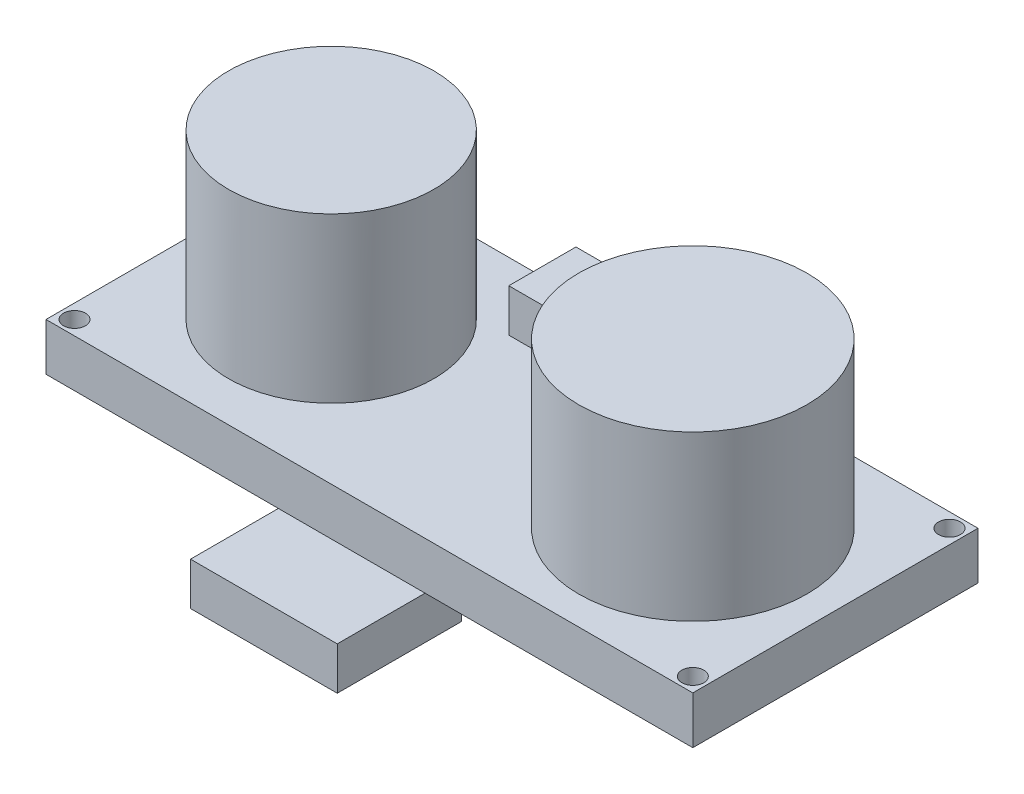
ISO-10303-21;
HEADER;
FILE_DESCRIPTION(('STEP AP214'),'2;1');
FILE_NAME('part.step','',(''),(''),'','','');
FILE_SCHEMA(('AUTOMOTIVE_DESIGN { 1 0 10303 214 1 1 1 1 }'));
ENDSEC;
DATA;
#1=APPLICATION_CONTEXT('core data for automotive mechanical design processes');
#2=APPLICATION_PROTOCOL_DEFINITION('international standard','automotive_design',2000,#1);
#3=PRODUCT_CONTEXT('',#1,'mechanical');
#4=PRODUCT('Part','Part','',(#3));
#5=PRODUCT_RELATED_PRODUCT_CATEGORY('part','',(#4));
#6=PRODUCT_DEFINITION_FORMATION('','',#4);
#7=PRODUCT_DEFINITION_CONTEXT('part definition',#1,'design');
#8=PRODUCT_DEFINITION('design','',#6,#7);
#9=PRODUCT_DEFINITION_SHAPE('','',#8);
#10=(LENGTH_UNIT() NAMED_UNIT(*) SI_UNIT(.MILLI.,.METRE.));
#11=(NAMED_UNIT(*) PLANE_ANGLE_UNIT() SI_UNIT($,.RADIAN.));
#12=(NAMED_UNIT(*) SI_UNIT($,.STERADIAN.) SOLID_ANGLE_UNIT());
#13=UNCERTAINTY_MEASURE_WITH_UNIT(LENGTH_MEASURE(1.E-05),#10,'distance_accuracy_value','');
#14=(GEOMETRIC_REPRESENTATION_CONTEXT(3) GLOBAL_UNCERTAINTY_ASSIGNED_CONTEXT((#13)) GLOBAL_UNIT_ASSIGNED_CONTEXT((#10,
#11,#12)) REPRESENTATION_CONTEXT('',''));
#15=CARTESIAN_POINT('',(0.,0.,0.));
#16=DIRECTION('',(0.,0.,1.));
#17=DIRECTION('',(1.,0.,0.));
#18=AXIS2_PLACEMENT_3D('',#15,#16,#17);
#19=CARTESIAN_POINT('',(0.,3.33,0.));
#20=DIRECTION('',(0.,-1.,0.));
#21=DIRECTION('',(0.,0.,-1.));
#22=AXIS2_PLACEMENT_3D('',#19,#20,#21);
#23=PLANE('',#22);
#24=CARTESIAN_POINT('',(-12.68,3.33,0.));
#25=DIRECTION('',(0.,-1.,0.));
#26=DIRECTION('',(0.,0.,-1.));
#27=AXIS2_PLACEMENT_3D('',#24,#25,#26);
#28=CIRCLE('',#27,7.20177005113428);
#29=CARTESIAN_POINT('',(-12.68,3.33,-7.20177005113428));
#30=VERTEX_POINT('',#29);
#31=EDGE_CURVE('E42',#30,#30,#28,.F.);
#32=ORIENTED_EDGE('',*,*,#31,.F.);
#33=EDGE_LOOP('',(#32));
#34=FACE_BOUND('',#33,.T.);
#35=DIRECTION('',(0.,0.,-1.));
#36=VECTOR('',#35,1.);
#37=CARTESIAN_POINT('',(22.68,3.33,10.));
#38=LINE('',#37,#36);
#39=CARTESIAN_POINT('',(22.68,3.33,10.));
#40=VERTEX_POINT('',#39);
#41=CARTESIAN_POINT('',(22.68,3.33,-10.));
#42=VERTEX_POINT('',#41);
#43=EDGE_CURVE('E212',#40,#42,#38,.T.);
#44=ORIENTED_EDGE('',*,*,#43,.T.);
#45=DIRECTION('',(-1.,0.,0.));
#46=VECTOR('',#45,1.);
#47=CARTESIAN_POINT('',(-22.68,3.33,-10.));
#48=LINE('',#47,#46);
#49=CARTESIAN_POINT('',(-22.68,3.33,-10.));
#50=VERTEX_POINT('',#49);
#51=EDGE_CURVE('E215',#42,#50,#48,.T.);
#52=ORIENTED_EDGE('',*,*,#51,.T.);
#53=DIRECTION('',(0.,0.,1.));
#54=VECTOR('',#53,1.);
#55=CARTESIAN_POINT('',(-22.68,3.33,10.));
#56=LINE('',#55,#54);
#57=CARTESIAN_POINT('',(-22.68,3.33,10.));
#58=VERTEX_POINT('',#57);
#59=EDGE_CURVE('E218',#50,#58,#56,.T.);
#60=ORIENTED_EDGE('',*,*,#59,.T.);
#61=DIRECTION('',(1.,0.,0.));
#62=VECTOR('',#61,1.);
#63=CARTESIAN_POINT('',(-22.68,3.33,10.));
#64=LINE('',#63,#62);
#65=EDGE_CURVE('E220',#58,#40,#64,.T.);
#66=ORIENTED_EDGE('',*,*,#65,.T.);
#67=EDGE_LOOP('',(#44,#52,#60,#66));
#68=FACE_BOUND('',#67,.T.);
#69=CARTESIAN_POINT('',(12.68,3.33,0.));
#70=DIRECTION('',(0.,-1.,0.));
#71=DIRECTION('',(0.,0.,-1.));
#72=AXIS2_PLACEMENT_3D('',#69,#70,#71);
#73=CIRCLE('',#72,8.);
#74=CARTESIAN_POINT('',(12.68,3.33,-8.));
#75=VERTEX_POINT('',#74);
#76=EDGE_CURVE('E243',#75,#75,#73,.F.);
#77=ORIENTED_EDGE('',*,*,#76,.F.);
#78=EDGE_LOOP('',(#77));
#79=FACE_BOUND('',#78,.T.);
#80=CARTESIAN_POINT('',(21.68,3.33,-9.));
#81=DIRECTION('',(0.,1.,0.));
#82=DIRECTION('',(0.,0.,1.));
#83=AXIS2_PLACEMENT_3D('',#80,#81,#82);
#84=CIRCLE('',#83,0.769999999999999);
#85=CARTESIAN_POINT('',(21.68,3.33,-8.23));
#86=VERTEX_POINT('',#85);
#87=EDGE_CURVE('E201',#86,#86,#84,.T.);
#88=ORIENTED_EDGE('',*,*,#87,.F.);
#89=EDGE_LOOP('',(#88));
#90=FACE_BOUND('',#89,.T.);
#91=CARTESIAN_POINT('',(21.68,3.33,9.));
#92=DIRECTION('',(0.,1.,0.));
#93=DIRECTION('',(0.,0.,1.));
#94=AXIS2_PLACEMENT_3D('',#91,#92,#93);
#95=CIRCLE('',#94,0.769999999999999);
#96=CARTESIAN_POINT('',(21.68,3.33,9.77));
#97=VERTEX_POINT('',#96);
#98=EDGE_CURVE('E197',#97,#97,#95,.T.);
#99=ORIENTED_EDGE('',*,*,#98,.F.);
#100=EDGE_LOOP('',(#99));
#101=FACE_BOUND('',#100,.T.);
#102=CARTESIAN_POINT('',(-21.68,3.33,9.));
#103=DIRECTION('',(0.,1.,0.));
#104=DIRECTION('',(0.,0.,1.));
#105=AXIS2_PLACEMENT_3D('',#102,#103,#104);
#106=CIRCLE('',#105,0.769999999999999);
#107=CARTESIAN_POINT('',(-21.68,3.33,9.77));
#108=VERTEX_POINT('',#107);
#109=EDGE_CURVE('E193',#108,#108,#106,.T.);
#110=ORIENTED_EDGE('',*,*,#109,.F.);
#111=EDGE_LOOP('',(#110));
#112=FACE_BOUND('',#111,.T.);
#113=CARTESIAN_POINT('',(-21.68,3.33,-9.));
#114=DIRECTION('',(0.,1.,0.));
#115=DIRECTION('',(0.,0.,1.));
#116=AXIS2_PLACEMENT_3D('',#113,#114,#115);
#117=CIRCLE('',#116,0.769999999999999);
#118=CARTESIAN_POINT('',(-21.68,3.33,-8.23));
#119=VERTEX_POINT('',#118);
#120=EDGE_CURVE('E190',#119,#119,#117,.T.);
#121=ORIENTED_EDGE('',*,*,#120,.F.);
#122=EDGE_LOOP('',(#121));
#123=FACE_BOUND('',#122,.T.);
#124=DIRECTION('',(0.,0.,1.));
#125=VECTOR('',#124,1.);
#126=CARTESIAN_POINT('',(-5.5,3.33,-5.275));
#127=LINE('',#126,#125);
#128=CARTESIAN_POINT('',(-5.5,3.33,-9.985));
#129=VERTEX_POINT('',#128);
#130=CARTESIAN_POINT('',(-5.5,3.33,-5.275));
#131=VERTEX_POINT('',#130);
#132=EDGE_CURVE('E152',#129,#131,#127,.T.);
#133=ORIENTED_EDGE('',*,*,#132,.F.);
#134=DIRECTION('',(-1.,0.,0.));
#135=VECTOR('',#134,1.);
#136=CARTESIAN_POINT('',(5.5,3.33,-9.985));
#137=LINE('',#136,#135);
#138=CARTESIAN_POINT('',(5.5,3.33,-9.985));
#139=VERTEX_POINT('',#138);
#140=EDGE_CURVE('E165',#139,#129,#137,.T.);
#141=ORIENTED_EDGE('',*,*,#140,.F.);
#142=DIRECTION('',(0.,0.,-1.));
#143=VECTOR('',#142,1.);
#144=CARTESIAN_POINT('',(5.5,3.33,-5.275));
#145=LINE('',#144,#143);
#146=CARTESIAN_POINT('',(5.5,3.33,-5.275));
#147=VERTEX_POINT('',#146);
#148=EDGE_CURVE('E174',#147,#139,#145,.T.);
#149=ORIENTED_EDGE('',*,*,#148,.F.);
#150=DIRECTION('',(1.,0.,0.));
#151=VECTOR('',#150,1.);
#152=CARTESIAN_POINT('',(5.5,3.33,-5.275));
#153=LINE('',#152,#151);
#154=EDGE_CURVE('E155',#131,#147,#153,.T.);
#155=ORIENTED_EDGE('',*,*,#154,.F.);
#156=EDGE_LOOP('',(#133,#141,#149,#155));
#157=FACE_BOUND('',#156,.T.);
#158=ADVANCED_FACE('F33',(#34,#68,#79,#90,#101,#112,#123,#157),#23,.F.);
#159=CARTESIAN_POINT('',(22.68,3.33,10.));
#160=DIRECTION('',(-1.,0.,0.));
#161=DIRECTION('',(0.,0.,1.));
#162=AXIS2_PLACEMENT_3D('',#159,#160,#161);
#163=PLANE('',#162);
#164=DIRECTION('',(0.,0.,-1.));
#165=VECTOR('',#164,1.);
#166=CARTESIAN_POINT('',(22.68,0.,10.));
#167=LINE('',#166,#165);
#168=CARTESIAN_POINT('',(22.68,0.,10.));
#169=VERTEX_POINT('',#168);
#170=CARTESIAN_POINT('',(22.68,0.,-10.));
#171=VERTEX_POINT('',#170);
#172=EDGE_CURVE('E211',#169,#171,#167,.T.);
#173=ORIENTED_EDGE('',*,*,#172,.T.);
#174=DIRECTION('',(0.,-1.,0.));
#175=VECTOR('',#174,1.);
#176=CARTESIAN_POINT('',(22.68,3.33,-10.));
#177=LINE('',#176,#175);
#178=EDGE_CURVE('E240',#42,#171,#177,.T.);
#179=ORIENTED_EDGE('',*,*,#178,.F.);
#180=ORIENTED_EDGE('',*,*,#43,.F.);
#181=DIRECTION('',(0.,-1.,0.));
#182=VECTOR('',#181,1.);
#183=CARTESIAN_POINT('',(22.68,3.33,10.));
#184=LINE('',#183,#182);
#185=EDGE_CURVE('E222',#40,#169,#184,.T.);
#186=ORIENTED_EDGE('',*,*,#185,.T.);
#187=EDGE_LOOP('',(#173,#179,#180,#186));
#188=FACE_BOUND('',#187,.T.);
#189=ADVANCED_FACE('F35',(#188),#163,.F.);
#190=CARTESIAN_POINT('',(-22.68,3.33,-10.));
#191=DIRECTION('',(0.,0.,1.));
#192=DIRECTION('',(1.,0.,0.));
#193=AXIS2_PLACEMENT_3D('',#190,#191,#192);
#194=PLANE('',#193);
#195=DIRECTION('',(-1.,0.,0.));
#196=VECTOR('',#195,1.);
#197=CARTESIAN_POINT('',(-22.68,0.,-10.));
#198=LINE('',#197,#196);
#199=CARTESIAN_POINT('',(-22.68,0.,-10.));
#200=VERTEX_POINT('',#199);
#201=EDGE_CURVE('E225',#171,#200,#198,.T.);
#202=ORIENTED_EDGE('',*,*,#201,.T.);
#203=DIRECTION('',(0.,-1.,0.));
#204=VECTOR('',#203,1.);
#205=CARTESIAN_POINT('',(-22.68,3.33,-10.));
#206=LINE('',#205,#204);
#207=EDGE_CURVE('E237',#50,#200,#206,.T.);
#208=ORIENTED_EDGE('',*,*,#207,.F.);
#209=ORIENTED_EDGE('',*,*,#51,.F.);
#210=ORIENTED_EDGE('',*,*,#178,.T.);
#211=EDGE_LOOP('',(#202,#208,#209,#210));
#212=FACE_BOUND('',#211,.T.);
#213=ADVANCED_FACE('F340',(#212),#194,.F.);
#214=CARTESIAN_POINT('',(-22.68,3.33,10.));
#215=DIRECTION('',(1.,0.,0.));
#216=DIRECTION('',(0.,0.,-1.));
#217=AXIS2_PLACEMENT_3D('',#214,#215,#216);
#218=PLANE('',#217);
#219=DIRECTION('',(0.,0.,1.));
#220=VECTOR('',#219,1.);
#221=CARTESIAN_POINT('',(-22.68,0.,10.));
#222=LINE('',#221,#220);
#223=CARTESIAN_POINT('',(-22.68,0.,10.));
#224=VERTEX_POINT('',#223);
#225=EDGE_CURVE('E227',#200,#224,#222,.T.);
#226=ORIENTED_EDGE('',*,*,#225,.T.);
#227=DIRECTION('',(0.,-1.,0.));
#228=VECTOR('',#227,1.);
#229=CARTESIAN_POINT('',(-22.68,3.33,10.));
#230=LINE('',#229,#228);
#231=EDGE_CURVE('E234',#58,#224,#230,.T.);
#232=ORIENTED_EDGE('',*,*,#231,.F.);
#233=ORIENTED_EDGE('',*,*,#59,.F.);
#234=ORIENTED_EDGE('',*,*,#207,.T.);
#235=EDGE_LOOP('',(#226,#232,#233,#234));
#236=FACE_BOUND('',#235,.T.);
#237=ADVANCED_FACE('F337',(#236),#218,.F.);
#238=CARTESIAN_POINT('',(-22.68,3.33,10.));
#239=DIRECTION('',(0.,0.,-1.));
#240=DIRECTION('',(-1.,0.,0.));
#241=AXIS2_PLACEMENT_3D('',#238,#239,#240);
#242=PLANE('',#241);
#243=DIRECTION('',(1.,0.,0.));
#244=VECTOR('',#243,1.);
#245=CARTESIAN_POINT('',(-22.68,0.,10.));
#246=LINE('',#245,#244);
#247=CARTESIAN_POINT('',(-6.38493764608229,0.,10.));
#248=VERTEX_POINT('',#247);
#249=EDGE_CURVE('E216',#224,#248,#246,.T.);
#250=ORIENTED_EDGE('',*,*,#249,.T.);
#251=CARTESIAN_POINT('',(3.90506235391771,0.,10.));
#252=VERTEX_POINT('',#251);
#253=EDGE_CURVE('E231',#248,#252,#246,.T.);
#254=ORIENTED_EDGE('',*,*,#253,.T.);
#255=EDGE_CURVE('E56',#252,#169,#246,.T.);
#256=ORIENTED_EDGE('',*,*,#255,.T.);
#257=ORIENTED_EDGE('',*,*,#185,.F.);
#258=ORIENTED_EDGE('',*,*,#65,.F.);
#259=ORIENTED_EDGE('',*,*,#231,.T.);
#260=EDGE_LOOP('',(#250,#254,#256,#257,#258,#259));
#261=FACE_BOUND('',#260,.T.);
#262=ADVANCED_FACE('F261',(#261),#242,.F.);
#263=CARTESIAN_POINT('',(0.,0.,0.));
#264=DIRECTION('',(0.,-1.,0.));
#265=DIRECTION('',(0.,0.,-1.));
#266=AXIS2_PLACEMENT_3D('',#263,#264,#265);
#267=PLANE('',#266);
#268=DIRECTION('',(0.,0.,-1.));
#269=VECTOR('',#268,1.);
#270=CARTESIAN_POINT('',(-6.38493764608228,0.,16.16));
#271=LINE('',#270,#269);
#272=CARTESIAN_POINT('',(-6.38493764608228,0.,7.46));
#273=VERTEX_POINT('',#272);
#274=EDGE_CURVE('E11',#248,#273,#271,.T.);
#275=ORIENTED_EDGE('',*,*,#274,.F.);
#276=ORIENTED_EDGE('',*,*,#249,.F.);
#277=ORIENTED_EDGE('',*,*,#225,.F.);
#278=ORIENTED_EDGE('',*,*,#201,.F.);
#279=ORIENTED_EDGE('',*,*,#172,.F.);
#280=ORIENTED_EDGE('',*,*,#255,.F.);
#281=DIRECTION('',(0.,0.,1.));
#282=VECTOR('',#281,1.);
#283=CARTESIAN_POINT('',(3.90506235391772,0.,16.16));
#284=LINE('',#283,#282);
#285=CARTESIAN_POINT('',(3.90506235391772,0.,7.46));
#286=VERTEX_POINT('',#285);
#287=EDGE_CURVE('E369',#286,#252,#284,.T.);
#288=ORIENTED_EDGE('',*,*,#287,.F.);
#289=DIRECTION('',(1.,0.,0.));
#290=VECTOR('',#289,1.);
#291=CARTESIAN_POINT('',(3.90506235391772,0.,7.46));
#292=LINE('',#291,#290);
#293=EDGE_CURVE('E51',#273,#286,#292,.T.);
#294=ORIENTED_EDGE('',*,*,#293,.F.);
#295=EDGE_LOOP('',(#275,#276,#277,#278,#279,#280,#288,#294));
#296=FACE_BOUND('',#295,.T.);
#297=CARTESIAN_POINT('',(-21.68,0.,-9.));
#298=DIRECTION('',(0.,-1.,0.));
#299=DIRECTION('',(0.,0.,-1.));
#300=AXIS2_PLACEMENT_3D('',#297,#298,#299);
#301=CIRCLE('',#300,0.769999999999999);
#302=CARTESIAN_POINT('',(-21.68,0.,-9.77));
#303=VERTEX_POINT('',#302);
#304=EDGE_CURVE('E37',#303,#303,#301,.T.);
#305=ORIENTED_EDGE('',*,*,#304,.F.);
#306=EDGE_LOOP('',(#305));
#307=FACE_BOUND('',#306,.T.);
#308=CARTESIAN_POINT('',(-21.68,0.,9.));
#309=DIRECTION('',(0.,-1.,0.));
#310=DIRECTION('',(0.,0.,-1.));
#311=AXIS2_PLACEMENT_3D('',#308,#309,#310);
#312=CIRCLE('',#311,0.769999999999999);
#313=CARTESIAN_POINT('',(-21.68,0.,8.23));
#314=VERTEX_POINT('',#313);
#315=EDGE_CURVE('E196',#314,#314,#312,.T.);
#316=ORIENTED_EDGE('',*,*,#315,.F.);
#317=EDGE_LOOP('',(#316));
#318=FACE_BOUND('',#317,.T.);
#319=CARTESIAN_POINT('',(21.68,0.,9.));
#320=DIRECTION('',(0.,-1.,0.));
#321=DIRECTION('',(0.,0.,-1.));
#322=AXIS2_PLACEMENT_3D('',#319,#320,#321);
#323=CIRCLE('',#322,0.769999999999999);
#324=CARTESIAN_POINT('',(21.68,0.,8.23));
#325=VERTEX_POINT('',#324);
#326=EDGE_CURVE('E200',#325,#325,#323,.T.);
#327=ORIENTED_EDGE('',*,*,#326,.F.);
#328=EDGE_LOOP('',(#327));
#329=FACE_BOUND('',#328,.T.);
#330=CARTESIAN_POINT('',(21.68,0.,-9.));
#331=DIRECTION('',(0.,-1.,0.));
#332=DIRECTION('',(0.,0.,-1.));
#333=AXIS2_PLACEMENT_3D('',#330,#331,#332);
#334=CIRCLE('',#333,0.769999999999999);
#335=CARTESIAN_POINT('',(21.68,0.,-9.77));
#336=VERTEX_POINT('',#335);
#337=EDGE_CURVE('E204',#336,#336,#334,.T.);
#338=ORIENTED_EDGE('',*,*,#337,.F.);
#339=EDGE_LOOP('',(#338));
#340=FACE_BOUND('',#339,.T.);
#341=ADVANCED_FACE('F257',(#296,#307,#318,#329,#340),#267,.T.);
#342=CARTESIAN_POINT('',(12.68,14.83,0.));
#343=DIRECTION('',(0.,-1.,0.));
#344=DIRECTION('',(0.,0.,-1.));
#345=AXIS2_PLACEMENT_3D('',#342,#343,#344);
#346=CYLINDRICAL_SURFACE('',#345,8.);
#347=CARTESIAN_POINT('',(12.68,14.83,0.));
#348=DIRECTION('',(0.,1.,0.));
#349=DIRECTION('',(0.,0.,1.));
#350=AXIS2_PLACEMENT_3D('',#347,#348,#349);
#351=CIRCLE('',#350,8.);
#352=CARTESIAN_POINT('',(12.68,14.83,8.));
#353=VERTEX_POINT('',#352);
#354=EDGE_CURVE('E208',#353,#353,#351,.T.);
#355=ORIENTED_EDGE('',*,*,#354,.F.);
#356=EDGE_LOOP('',(#355));
#357=FACE_BOUND('',#356,.T.);
#358=ORIENTED_EDGE('',*,*,#76,.T.);
#359=EDGE_LOOP('',(#358));
#360=FACE_BOUND('',#359,.T.);
#361=ADVANCED_FACE('F260',(#357,#360),#346,.T.);
#362=CARTESIAN_POINT('',(12.68,14.83,0.));
#363=DIRECTION('',(0.,1.,0.));
#364=DIRECTION('',(0.,0.,1.));
#365=AXIS2_PLACEMENT_3D('',#362,#363,#364);
#366=PLANE('',#365);
#367=ORIENTED_EDGE('',*,*,#354,.T.);
#368=EDGE_LOOP('',(#367));
#369=FACE_BOUND('',#368,.T.);
#370=ADVANCED_FACE('F327',(#369),#366,.T.);
#371=CARTESIAN_POINT('',(-12.68,14.83,0.));
#372=DIRECTION('',(0.,-1.,0.));
#373=DIRECTION('',(0.,0.,-1.));
#374=AXIS2_PLACEMENT_3D('',#371,#372,#373);
#375=CYLINDRICAL_SURFACE('',#374,7.20177005113428);
#376=CARTESIAN_POINT('',(-12.68,14.83,0.));
#377=DIRECTION('',(0.,1.,0.));
#378=DIRECTION('',(0.,0.,1.));
#379=AXIS2_PLACEMENT_3D('',#376,#377,#378);
#380=CIRCLE('',#379,7.20177005113428);
#381=CARTESIAN_POINT('',(-12.68,14.83,7.20177005113428));
#382=VERTEX_POINT('',#381);
#383=EDGE_CURVE('E205',#382,#382,#380,.T.);
#384=ORIENTED_EDGE('',*,*,#383,.F.);
#385=EDGE_LOOP('',(#384));
#386=FACE_BOUND('',#385,.T.);
#387=ORIENTED_EDGE('',*,*,#31,.T.);
#388=EDGE_LOOP('',(#387));
#389=FACE_BOUND('',#388,.T.);
#390=ADVANCED_FACE('F323',(#386,#389),#375,.T.);
#391=CARTESIAN_POINT('',(-12.68,14.83,0.));
#392=DIRECTION('',(0.,1.,0.));
#393=DIRECTION('',(0.,0.,1.));
#394=AXIS2_PLACEMENT_3D('',#391,#392,#393);
#395=PLANE('',#394);
#396=ORIENTED_EDGE('',*,*,#383,.T.);
#397=EDGE_LOOP('',(#396));
#398=FACE_BOUND('',#397,.T.);
#399=ADVANCED_FACE('F271',(#398),#395,.T.);
#400=CARTESIAN_POINT('',(21.68,-8.17,-9.));
#401=DIRECTION('',(0.,1.,0.));
#402=DIRECTION('',(0.,0.,1.));
#403=AXIS2_PLACEMENT_3D('',#400,#401,#402);
#404=CYLINDRICAL_SURFACE('',#403,0.769999999999999);
#405=ORIENTED_EDGE('',*,*,#337,.T.);
#406=EDGE_LOOP('',(#405));
#407=FACE_BOUND('',#406,.T.);
#408=ORIENTED_EDGE('',*,*,#87,.T.);
#409=EDGE_LOOP('',(#408));
#410=FACE_BOUND('',#409,.T.);
#411=ADVANCED_FACE('F267',(#407,#410),#404,.F.);
#412=CARTESIAN_POINT('',(21.68,-8.17,9.));
#413=DIRECTION('',(0.,1.,0.));
#414=DIRECTION('',(0.,0.,1.));
#415=AXIS2_PLACEMENT_3D('',#412,#413,#414);
#416=CYLINDRICAL_SURFACE('',#415,0.769999999999999);
#417=ORIENTED_EDGE('',*,*,#326,.T.);
#418=EDGE_LOOP('',(#417));
#419=FACE_BOUND('',#418,.T.);
#420=ORIENTED_EDGE('',*,*,#98,.T.);
#421=EDGE_LOOP('',(#420));
#422=FACE_BOUND('',#421,.T.);
#423=ADVANCED_FACE('F270',(#419,#422),#416,.F.);
#424=CARTESIAN_POINT('',(-21.68,-8.17,9.));
#425=DIRECTION('',(0.,1.,0.));
#426=DIRECTION('',(0.,0.,1.));
#427=AXIS2_PLACEMENT_3D('',#424,#425,#426);
#428=CYLINDRICAL_SURFACE('',#427,0.769999999999999);
#429=ORIENTED_EDGE('',*,*,#315,.T.);
#430=EDGE_LOOP('',(#429));
#431=FACE_BOUND('',#430,.T.);
#432=ORIENTED_EDGE('',*,*,#109,.T.);
#433=EDGE_LOOP('',(#432));
#434=FACE_BOUND('',#433,.T.);
#435=ADVANCED_FACE('F254',(#431,#434),#428,.F.);
#436=CARTESIAN_POINT('',(-21.68,-8.17,-9.));
#437=DIRECTION('',(0.,1.,0.));
#438=DIRECTION('',(0.,0.,1.));
#439=AXIS2_PLACEMENT_3D('',#436,#437,#438);
#440=CYLINDRICAL_SURFACE('',#439,0.769999999999999);
#441=ORIENTED_EDGE('',*,*,#304,.T.);
#442=EDGE_LOOP('',(#441));
#443=FACE_BOUND('',#442,.T.);
#444=ORIENTED_EDGE('',*,*,#120,.T.);
#445=EDGE_LOOP('',(#444));
#446=FACE_BOUND('',#445,.T.);
#447=ADVANCED_FACE('F309',(#443,#446),#440,.F.);
#448=CARTESIAN_POINT('',(-5.5,6.33,-5.275));
#449=DIRECTION('',(1.,0.,0.));
#450=DIRECTION('',(0.,0.,-1.));
#451=AXIS2_PLACEMENT_3D('',#448,#449,#450);
#452=PLANE('',#451);
#453=ORIENTED_EDGE('',*,*,#132,.T.);
#454=DIRECTION('',(0.,-1.,0.));
#455=VECTOR('',#454,1.);
#456=CARTESIAN_POINT('',(-5.5,6.33,-5.275));
#457=LINE('',#456,#455);
#458=CARTESIAN_POINT('',(-5.5,6.33,-5.275));
#459=VERTEX_POINT('',#458);
#460=EDGE_CURVE('E187',#459,#131,#457,.T.);
#461=ORIENTED_EDGE('',*,*,#460,.F.);
#462=DIRECTION('',(0.,0.,1.));
#463=VECTOR('',#462,1.);
#464=CARTESIAN_POINT('',(-5.5,6.33,-5.275));
#465=LINE('',#464,#463);
#466=CARTESIAN_POINT('',(-5.5,6.33,-9.985));
#467=VERTEX_POINT('',#466);
#468=EDGE_CURVE('E161',#467,#459,#465,.T.);
#469=ORIENTED_EDGE('',*,*,#468,.F.);
#470=DIRECTION('',(0.,-1.,0.));
#471=VECTOR('',#470,1.);
#472=CARTESIAN_POINT('',(-5.5,6.33,-9.985));
#473=LINE('',#472,#471);
#474=EDGE_CURVE('E170',#467,#129,#473,.T.);
#475=ORIENTED_EDGE('',*,*,#474,.T.);
#476=EDGE_LOOP('',(#453,#461,#469,#475));
#477=FACE_BOUND('',#476,.T.);
#478=ADVANCED_FACE('F293',(#477),#452,.F.);
#479=CARTESIAN_POINT('',(5.5,6.33,-5.275));
#480=DIRECTION('',(0.,0.,-1.));
#481=DIRECTION('',(-1.,0.,0.));
#482=AXIS2_PLACEMENT_3D('',#479,#480,#481);
#483=PLANE('',#482);
#484=ORIENTED_EDGE('',*,*,#154,.T.);
#485=DIRECTION('',(0.,-1.,0.));
#486=VECTOR('',#485,1.);
#487=CARTESIAN_POINT('',(5.5,6.33,-5.275));
#488=LINE('',#487,#486);
#489=CARTESIAN_POINT('',(5.5,6.33,-5.275));
#490=VERTEX_POINT('',#489);
#491=EDGE_CURVE('E184',#490,#147,#488,.T.);
#492=ORIENTED_EDGE('',*,*,#491,.F.);
#493=DIRECTION('',(1.,0.,0.));
#494=VECTOR('',#493,1.);
#495=CARTESIAN_POINT('',(5.5,6.33,-5.275));
#496=LINE('',#495,#494);
#497=EDGE_CURVE('E164',#459,#490,#496,.T.);
#498=ORIENTED_EDGE('',*,*,#497,.F.);
#499=ORIENTED_EDGE('',*,*,#460,.T.);
#500=EDGE_LOOP('',(#484,#492,#498,#499));
#501=FACE_BOUND('',#500,.T.);
#502=ADVANCED_FACE('F301',(#501),#483,.F.);
#503=CARTESIAN_POINT('',(5.5,6.33,-5.275));
#504=DIRECTION('',(-1.,0.,0.));
#505=DIRECTION('',(0.,0.,1.));
#506=AXIS2_PLACEMENT_3D('',#503,#504,#505);
#507=PLANE('',#506);
#508=ORIENTED_EDGE('',*,*,#148,.T.);
#509=DIRECTION('',(0.,-1.,0.));
#510=VECTOR('',#509,1.);
#511=CARTESIAN_POINT('',(5.5,6.33,-9.985));
#512=LINE('',#511,#510);
#513=CARTESIAN_POINT('',(5.5,6.33,-9.985));
#514=VERTEX_POINT('',#513);
#515=EDGE_CURVE('E181',#514,#139,#512,.T.);
#516=ORIENTED_EDGE('',*,*,#515,.F.);
#517=DIRECTION('',(0.,0.,-1.));
#518=VECTOR('',#517,1.);
#519=CARTESIAN_POINT('',(5.5,6.33,-5.275));
#520=LINE('',#519,#518);
#521=EDGE_CURVE('E167',#490,#514,#520,.T.);
#522=ORIENTED_EDGE('',*,*,#521,.F.);
#523=ORIENTED_EDGE('',*,*,#491,.T.);
#524=EDGE_LOOP('',(#508,#516,#522,#523));
#525=FACE_BOUND('',#524,.T.);
#526=ADVANCED_FACE('F299',(#525),#507,.F.);
#527=CARTESIAN_POINT('',(5.5,6.33,-9.985));
#528=DIRECTION('',(0.,0.,1.));
#529=DIRECTION('',(1.,0.,0.));
#530=AXIS2_PLACEMENT_3D('',#527,#528,#529);
#531=PLANE('',#530);
#532=ORIENTED_EDGE('',*,*,#140,.T.);
#533=ORIENTED_EDGE('',*,*,#474,.F.);
#534=DIRECTION('',(-1.,0.,0.));
#535=VECTOR('',#534,1.);
#536=CARTESIAN_POINT('',(5.5,6.33,-9.985));
#537=LINE('',#536,#535);
#538=EDGE_CURVE('E169',#514,#467,#537,.T.);
#539=ORIENTED_EDGE('',*,*,#538,.F.);
#540=ORIENTED_EDGE('',*,*,#515,.T.);
#541=EDGE_LOOP('',(#532,#533,#539,#540));
#542=FACE_BOUND('',#541,.T.);
#543=ADVANCED_FACE('F289',(#542),#531,.F.);
#544=CARTESIAN_POINT('',(0.,6.33,0.));
#545=DIRECTION('',(0.,1.,0.));
#546=DIRECTION('',(0.,0.,1.));
#547=AXIS2_PLACEMENT_3D('',#544,#545,#546);
#548=PLANE('',#547);
#549=ORIENTED_EDGE('',*,*,#468,.T.);
#550=ORIENTED_EDGE('',*,*,#497,.T.);
#551=ORIENTED_EDGE('',*,*,#521,.T.);
#552=ORIENTED_EDGE('',*,*,#538,.T.);
#553=EDGE_LOOP('',(#549,#550,#551,#552));
#554=FACE_BOUND('',#553,.T.);
#555=ADVANCED_FACE('F295',(#554),#548,.T.);
#556=CARTESIAN_POINT('',(0.,0.,0.));
#557=DIRECTION('',(0.,1.,0.));
#558=DIRECTION('',(0.,0.,1.));
#559=AXIS2_PLACEMENT_3D('',#556,#557,#558);
#560=PLANE('',#559);
#561=ORIENTED_EDGE('',*,*,#253,.F.);
#562=CARTESIAN_POINT('',(-6.38493764608228,0.,16.16));
#563=VERTEX_POINT('',#562);
#564=EDGE_CURVE('E44',#563,#248,#271,.T.);
#565=ORIENTED_EDGE('',*,*,#564,.F.);
#566=DIRECTION('',(-1.,0.,0.));
#567=VECTOR('',#566,1.);
#568=CARTESIAN_POINT('',(3.90506235391772,0.,16.16));
#569=LINE('',#568,#567);
#570=CARTESIAN_POINT('',(3.90506235391772,0.,16.16));
#571=VERTEX_POINT('',#570);
#572=EDGE_CURVE('E148',#571,#563,#569,.T.);
#573=ORIENTED_EDGE('',*,*,#572,.F.);
#574=EDGE_CURVE('E362',#252,#571,#284,.T.);
#575=ORIENTED_EDGE('',*,*,#574,.F.);
#576=EDGE_LOOP('',(#561,#565,#573,#575));
#577=FACE_BOUND('',#576,.T.);
#578=ADVANCED_FACE('F360',(#577),#560,.T.);
#579=CARTESIAN_POINT('',(-6.38493764608228,-3.,16.16));
#580=DIRECTION('',(1.,0.,0.));
#581=DIRECTION('',(0.,0.,-1.));
#582=AXIS2_PLACEMENT_3D('',#579,#580,#581);
#583=PLANE('',#582);
#584=ORIENTED_EDGE('',*,*,#564,.T.);
#585=ORIENTED_EDGE('',*,*,#274,.T.);
#586=DIRECTION('',(0.,1.,0.));
#587=VECTOR('',#586,1.);
#588=CARTESIAN_POINT('',(-6.38493764608228,-3.,7.46));
#589=LINE('',#588,#587);
#590=CARTESIAN_POINT('',(-6.38493764608228,-3.,7.46));
#591=VERTEX_POINT('',#590);
#592=EDGE_CURVE('E133',#591,#273,#589,.T.);
#593=ORIENTED_EDGE('',*,*,#592,.F.);
#594=DIRECTION('',(0.,0.,-1.));
#595=VECTOR('',#594,1.);
#596=CARTESIAN_POINT('',(-6.38493764608228,-3.,16.16));
#597=LINE('',#596,#595);
#598=CARTESIAN_POINT('',(-6.38493764608228,-3.,16.16));
#599=VERTEX_POINT('',#598);
#600=EDGE_CURVE('E139',#599,#591,#597,.T.);
#601=ORIENTED_EDGE('',*,*,#600,.F.);
#602=DIRECTION('',(0.,1.,0.));
#603=VECTOR('',#602,1.);
#604=CARTESIAN_POINT('',(-6.38493764608228,-3.,16.16));
#605=LINE('',#604,#603);
#606=EDGE_CURVE('E364',#599,#563,#605,.T.);
#607=ORIENTED_EDGE('',*,*,#606,.T.);
#608=EDGE_LOOP('',(#584,#585,#593,#601,#607));
#609=FACE_BOUND('',#608,.T.);
#610=ADVANCED_FACE('F151',(#609),#583,.F.);
#611=CARTESIAN_POINT('',(3.90506235391772,-3.,7.46));
#612=DIRECTION('',(0.,0.,1.));
#613=DIRECTION('',(1.,0.,0.));
#614=AXIS2_PLACEMENT_3D('',#611,#612,#613);
#615=PLANE('',#614);
#616=ORIENTED_EDGE('',*,*,#293,.T.);
#617=DIRECTION('',(0.,1.,0.));
#618=VECTOR('',#617,1.);
#619=CARTESIAN_POINT('',(3.90506235391772,-3.,7.46));
#620=LINE('',#619,#618);
#621=CARTESIAN_POINT('',(3.90506235391772,-3.,7.46));
#622=VERTEX_POINT('',#621);
#623=EDGE_CURVE('E135',#622,#286,#620,.T.);
#624=ORIENTED_EDGE('',*,*,#623,.F.);
#625=DIRECTION('',(1.,0.,0.));
#626=VECTOR('',#625,1.);
#627=CARTESIAN_POINT('',(3.90506235391772,-3.,7.46));
#628=LINE('',#627,#626);
#629=EDGE_CURVE('E129',#591,#622,#628,.T.);
#630=ORIENTED_EDGE('',*,*,#629,.F.);
#631=ORIENTED_EDGE('',*,*,#592,.T.);
#632=EDGE_LOOP('',(#616,#624,#630,#631));
#633=FACE_BOUND('',#632,.T.);
#634=ADVANCED_FACE('F131',(#633),#615,.F.);
#635=CARTESIAN_POINT('',(3.90506235391772,-3.,16.16));
#636=DIRECTION('',(-1.,0.,0.));
#637=DIRECTION('',(0.,0.,1.));
#638=AXIS2_PLACEMENT_3D('',#635,#636,#637);
#639=PLANE('',#638);
#640=ORIENTED_EDGE('',*,*,#287,.T.);
#641=ORIENTED_EDGE('',*,*,#574,.T.);
#642=DIRECTION('',(0.,1.,0.));
#643=VECTOR('',#642,1.);
#644=CARTESIAN_POINT('',(3.90506235391772,-3.,16.16));
#645=LINE('',#644,#643);
#646=CARTESIAN_POINT('',(3.90506235391772,-3.,16.16));
#647=VERTEX_POINT('',#646);
#648=EDGE_CURVE('E157',#647,#571,#645,.T.);
#649=ORIENTED_EDGE('',*,*,#648,.F.);
#650=DIRECTION('',(0.,0.,1.));
#651=VECTOR('',#650,1.);
#652=CARTESIAN_POINT('',(3.90506235391772,-3.,16.16));
#653=LINE('',#652,#651);
#654=EDGE_CURVE('E138',#622,#647,#653,.T.);
#655=ORIENTED_EDGE('',*,*,#654,.F.);
#656=ORIENTED_EDGE('',*,*,#623,.T.);
#657=EDGE_LOOP('',(#640,#641,#649,#655,#656));
#658=FACE_BOUND('',#657,.T.);
#659=ADVANCED_FACE('F377',(#658),#639,.F.);
#660=CARTESIAN_POINT('',(3.90506235391772,-3.,16.16));
#661=DIRECTION('',(0.,0.,-1.));
#662=DIRECTION('',(-1.,0.,0.));
#663=AXIS2_PLACEMENT_3D('',#660,#661,#662);
#664=PLANE('',#663);
#665=ORIENTED_EDGE('',*,*,#572,.T.);
#666=ORIENTED_EDGE('',*,*,#606,.F.);
#667=DIRECTION('',(-1.,0.,0.));
#668=VECTOR('',#667,1.);
#669=CARTESIAN_POINT('',(3.90506235391772,-3.,16.16));
#670=LINE('',#669,#668);
#671=EDGE_CURVE('E144',#647,#599,#670,.T.);
#672=ORIENTED_EDGE('',*,*,#671,.F.);
#673=ORIENTED_EDGE('',*,*,#648,.T.);
#674=EDGE_LOOP('',(#665,#666,#672,#673));
#675=FACE_BOUND('',#674,.T.);
#676=ADVANCED_FACE('F375',(#675),#664,.F.);
#677=CARTESIAN_POINT('',(0.,-3.,0.));
#678=DIRECTION('',(0.,1.,0.));
#679=DIRECTION('',(0.,0.,1.));
#680=AXIS2_PLACEMENT_3D('',#677,#678,#679);
#681=PLANE('',#680);
#682=ORIENTED_EDGE('',*,*,#600,.T.);
#683=ORIENTED_EDGE('',*,*,#629,.T.);
#684=ORIENTED_EDGE('',*,*,#654,.T.);
#685=ORIENTED_EDGE('',*,*,#671,.T.);
#686=EDGE_LOOP('',(#682,#683,#684,#685));
#687=FACE_BOUND('',#686,.T.);
#688=ADVANCED_FACE('F142',(#687),#681,.F.);
#689=CLOSED_SHELL('',(#158,#189,#213,#237,#262,#341,#361,#370,#390,#399,#411,#423,#435,#447,
#478,#502,#526,#543,#555,#578,#610,#634,#659,#676,#688));
#690=MANIFOLD_SOLID_BREP('B2',#689);
#691=ADVANCED_BREP_SHAPE_REPRESENTATION('',(#18,#690),#14);
#692=SHAPE_DEFINITION_REPRESENTATION(#9,#691);
ENDSEC;
END-ISO-10303-21;
